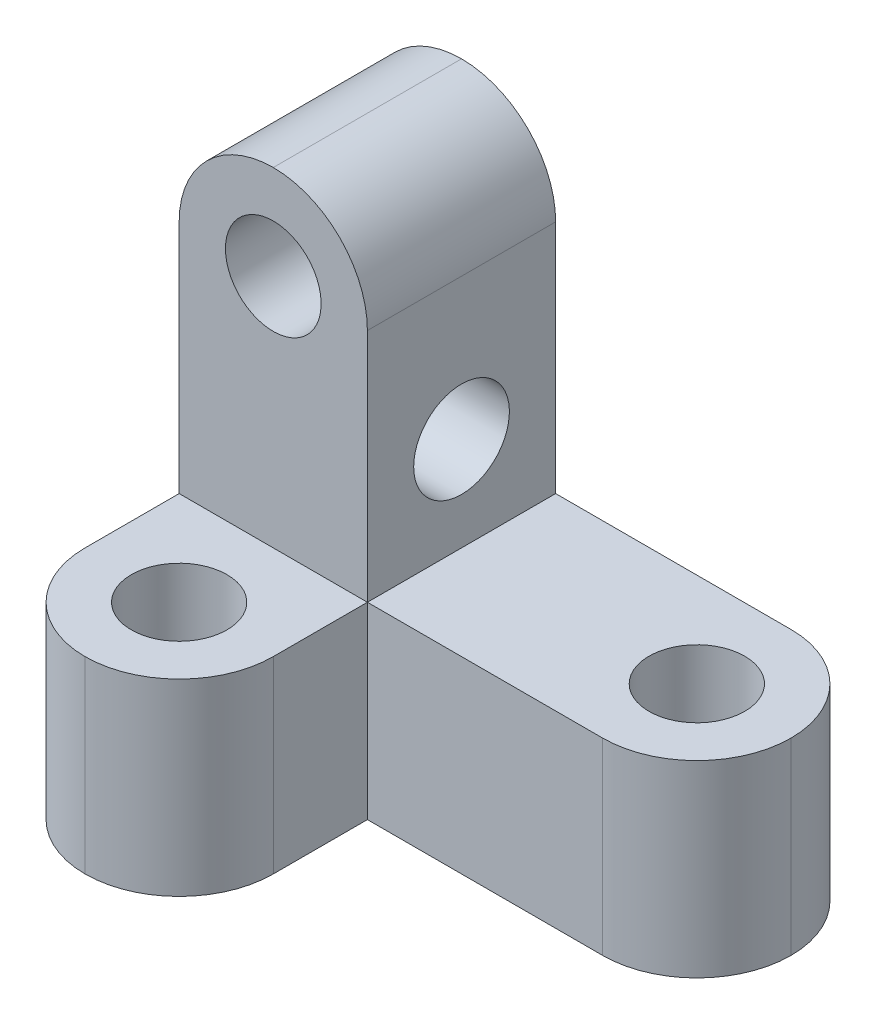
ISO-10303-21;
HEADER;
FILE_DESCRIPTION(('STEP AP214'),'2;1');
FILE_NAME('part.step','',(''),(''),'','','');
FILE_SCHEMA(('AUTOMOTIVE_DESIGN { 1 0 10303 214 1 1 1 1 }'));
ENDSEC;
DATA;
#1=APPLICATION_CONTEXT('core data for automotive mechanical design processes');
#2=APPLICATION_PROTOCOL_DEFINITION('international standard','automotive_design',2000,#1);
#3=PRODUCT_CONTEXT('',#1,'mechanical');
#4=PRODUCT('Part','Part','',(#3));
#5=PRODUCT_RELATED_PRODUCT_CATEGORY('part','',(#4));
#6=PRODUCT_DEFINITION_FORMATION('','',#4);
#7=PRODUCT_DEFINITION_CONTEXT('part definition',#1,'design');
#8=PRODUCT_DEFINITION('design','',#6,#7);
#9=PRODUCT_DEFINITION_SHAPE('','',#8);
#10=(LENGTH_UNIT() NAMED_UNIT(*) SI_UNIT(.MILLI.,.METRE.));
#11=(NAMED_UNIT(*) PLANE_ANGLE_UNIT() SI_UNIT($,.RADIAN.));
#12=(NAMED_UNIT(*) SI_UNIT($,.STERADIAN.) SOLID_ANGLE_UNIT());
#13=UNCERTAINTY_MEASURE_WITH_UNIT(LENGTH_MEASURE(1.E-05),#10,'distance_accuracy_value','');
#14=(GEOMETRIC_REPRESENTATION_CONTEXT(3) GLOBAL_UNCERTAINTY_ASSIGNED_CONTEXT((#13)) GLOBAL_UNIT_ASSIGNED_CONTEXT((#10,
#11,#12)) REPRESENTATION_CONTEXT('',''));
#15=CARTESIAN_POINT('',(0.,0.,0.));
#16=DIRECTION('',(0.,0.,1.));
#17=DIRECTION('',(1.,0.,0.));
#18=AXIS2_PLACEMENT_3D('',#15,#16,#17);
#19=CARTESIAN_POINT('',(12.,33.,0.));
#20=DIRECTION('',(-1.,0.,0.));
#21=DIRECTION('',(0.,-1.,0.));
#22=AXIS2_PLACEMENT_3D('',#19,#20,#21);
#23=PLANE('',#22);
#24=DIRECTION('',(0.,0.,1.));
#25=VECTOR('',#24,1.);
#26=CARTESIAN_POINT('',(12.,12.,0.));
#27=LINE('',#26,#25);
#28=CARTESIAN_POINT('',(12.,12.,12.));
#29=VERTEX_POINT('',#28);
#30=CARTESIAN_POINT('',(12.,12.,18.));
#31=VERTEX_POINT('',#30);
#32=EDGE_CURVE('E138',#29,#31,#27,.T.);
#33=ORIENTED_EDGE('',*,*,#32,.T.);
#34=DIRECTION('',(0.,-1.,0.));
#35=VECTOR('',#34,1.);
#36=CARTESIAN_POINT('',(12.,33.,18.));
#37=LINE('',#36,#35);
#38=CARTESIAN_POINT('',(12.,0.,18.));
#39=VERTEX_POINT('',#38);
#40=EDGE_CURVE('E206',#31,#39,#37,.T.);
#41=ORIENTED_EDGE('',*,*,#40,.T.);
#42=DIRECTION('',(0.,0.,-1.));
#43=VECTOR('',#42,1.);
#44=CARTESIAN_POINT('',(12.,0.,24.));
#45=LINE('',#44,#43);
#46=CARTESIAN_POINT('',(12.,0.,12.));
#47=VERTEX_POINT('',#46);
#48=EDGE_CURVE('E150',#39,#47,#45,.T.);
#49=ORIENTED_EDGE('',*,*,#48,.T.);
#50=DIRECTION('',(0.,-1.,0.));
#51=VECTOR('',#50,1.);
#52=CARTESIAN_POINT('',(12.,33.,12.));
#53=LINE('',#52,#51);
#54=EDGE_CURVE('E154',#29,#47,#53,.T.);
#55=ORIENTED_EDGE('',*,*,#54,.F.);
#56=EDGE_LOOP('',(#33,#41,#49,#55));
#57=FACE_BOUND('',#56,.T.);
#58=ADVANCED_FACE('F32',(#57),#23,.F.);
#59=CARTESIAN_POINT('',(0.,33.,0.));
#60=DIRECTION('',(1.,0.,0.));
#61=DIRECTION('',(0.,0.,-1.));
#62=AXIS2_PLACEMENT_3D('',#59,#60,#61);
#63=PLANE('',#62);
#64=CARTESIAN_POINT('',(0.,18.,6.));
#65=DIRECTION('',(-1.,0.,0.));
#66=DIRECTION('',(0.,0.,1.));
#67=AXIS2_PLACEMENT_3D('',#64,#65,#66);
#68=CIRCLE('',#67,3.05);
#69=CARTESIAN_POINT('',(0.,18.,9.05));
#70=VERTEX_POINT('',#69);
#71=EDGE_CURVE('E179',#70,#70,#68,.T.);
#72=ORIENTED_EDGE('',*,*,#71,.F.);
#73=EDGE_LOOP('',(#72));
#74=FACE_BOUND('',#73,.T.);
#75=DIRECTION('',(0.,0.,1.));
#76=VECTOR('',#75,1.);
#77=CARTESIAN_POINT('',(0.,0.,0.));
#78=LINE('',#77,#76);
#79=CARTESIAN_POINT('',(0.,0.,0.));
#80=VERTEX_POINT('',#79);
#81=CARTESIAN_POINT('',(0.,0.,18.));
#82=VERTEX_POINT('',#81);
#83=EDGE_CURVE('E167',#80,#82,#78,.T.);
#84=ORIENTED_EDGE('',*,*,#83,.T.);
#85=DIRECTION('',(0.,-1.,0.));
#86=VECTOR('',#85,1.);
#87=CARTESIAN_POINT('',(0.,33.,18.));
#88=LINE('',#87,#86);
#89=CARTESIAN_POINT('',(0.,12.,18.));
#90=VERTEX_POINT('',#89);
#91=EDGE_CURVE('E145',#82,#90,#88,.F.);
#92=ORIENTED_EDGE('',*,*,#91,.T.);
#93=DIRECTION('',(0.,0.,1.));
#94=VECTOR('',#93,1.);
#95=CARTESIAN_POINT('',(0.,12.,24.));
#96=LINE('',#95,#94);
#97=CARTESIAN_POINT('',(0.,12.,12.));
#98=VERTEX_POINT('',#97);
#99=EDGE_CURVE('E131',#98,#90,#96,.T.);
#100=ORIENTED_EDGE('',*,*,#99,.F.);
#101=DIRECTION('',(0.,-1.,0.));
#102=VECTOR('',#101,1.);
#103=CARTESIAN_POINT('',(0.,33.,12.));
#104=LINE('',#103,#102);
#105=CARTESIAN_POINT('',(0.,27.,12.));
#106=VERTEX_POINT('',#105);
#107=EDGE_CURVE('E120',#106,#98,#104,.T.);
#108=ORIENTED_EDGE('',*,*,#107,.F.);
#109=DIRECTION('',(0.,0.,1.));
#110=VECTOR('',#109,1.);
#111=CARTESIAN_POINT('',(0.,27.,0.));
#112=LINE('',#111,#110);
#113=CARTESIAN_POINT('',(0.,27.,0.));
#114=VERTEX_POINT('',#113);
#115=EDGE_CURVE('E199',#106,#114,#112,.F.);
#116=ORIENTED_EDGE('',*,*,#115,.T.);
#117=DIRECTION('',(0.,-1.,0.));
#118=VECTOR('',#117,1.);
#119=CARTESIAN_POINT('',(0.,33.,0.));
#120=LINE('',#119,#118);
#121=EDGE_CURVE('E172',#114,#80,#120,.T.);
#122=ORIENTED_EDGE('',*,*,#121,.T.);
#123=EDGE_LOOP('',(#84,#92,#100,#108,#116,#122));
#124=FACE_BOUND('',#123,.T.);
#125=ADVANCED_FACE('F143',(#74,#124),#63,.F.);
#126=CARTESIAN_POINT('',(0.,33.,0.));
#127=DIRECTION('',(0.,0.,1.));
#128=DIRECTION('',(1.,0.,0.));
#129=AXIS2_PLACEMENT_3D('',#126,#127,#128);
#130=PLANE('',#129);
#131=CARTESIAN_POINT('',(6.,27.,0.));
#132=DIRECTION('',(0.,0.,-1.));
#133=DIRECTION('',(-1.,0.,0.));
#134=AXIS2_PLACEMENT_3D('',#131,#132,#133);
#135=CIRCLE('',#134,3.05);
#136=CARTESIAN_POINT('',(2.95,27.,0.));
#137=VERTEX_POINT('',#136);
#138=EDGE_CURVE('E191',#137,#137,#135,.T.);
#139=ORIENTED_EDGE('',*,*,#138,.F.);
#140=EDGE_LOOP('',(#139));
#141=FACE_BOUND('',#140,.T.);
#142=CARTESIAN_POINT('',(6.,27.,0.));
#143=DIRECTION('',(0.,0.,1.));
#144=DIRECTION('',(1.,0.,0.));
#145=AXIS2_PLACEMENT_3D('',#142,#143,#144);
#146=CIRCLE('',#145,6.);
#147=CARTESIAN_POINT('',(6.,33.,0.));
#148=VERTEX_POINT('',#147);
#149=EDGE_CURVE('E217',#114,#148,#146,.F.);
#150=ORIENTED_EDGE('',*,*,#149,.T.);
#151=CARTESIAN_POINT('',(6.,27.,0.));
#152=DIRECTION('',(0.,0.,1.));
#153=DIRECTION('',(1.,0.,0.));
#154=AXIS2_PLACEMENT_3D('',#151,#152,#153);
#155=CIRCLE('',#154,6.);
#156=CARTESIAN_POINT('',(12.,27.,0.));
#157=VERTEX_POINT('',#156);
#158=EDGE_CURVE('E219',#148,#157,#155,.F.);
#159=ORIENTED_EDGE('',*,*,#158,.T.);
#160=DIRECTION('',(0.,-1.,0.));
#161=VECTOR('',#160,1.);
#162=CARTESIAN_POINT('',(12.,33.,0.));
#163=LINE('',#162,#161);
#164=CARTESIAN_POINT('',(12.,12.,0.));
#165=VERTEX_POINT('',#164);
#166=EDGE_CURVE('E159',#157,#165,#163,.T.);
#167=ORIENTED_EDGE('',*,*,#166,.T.);
#168=DIRECTION('',(1.,0.,0.));
#169=VECTOR('',#168,1.);
#170=CARTESIAN_POINT('',(33.,12.,0.));
#171=LINE('',#170,#169);
#172=CARTESIAN_POINT('',(27.,12.,0.));
#173=VERTEX_POINT('',#172);
#174=EDGE_CURVE('E161',#165,#173,#171,.T.);
#175=ORIENTED_EDGE('',*,*,#174,.T.);
#176=DIRECTION('',(0.,-1.,0.));
#177=VECTOR('',#176,1.);
#178=CARTESIAN_POINT('',(27.,33.,0.));
#179=LINE('',#178,#177);
#180=CARTESIAN_POINT('',(27.,0.,0.));
#181=VERTEX_POINT('',#180);
#182=EDGE_CURVE('E214',#173,#181,#179,.T.);
#183=ORIENTED_EDGE('',*,*,#182,.T.);
#184=DIRECTION('',(-1.,0.,0.));
#185=VECTOR('',#184,1.);
#186=CARTESIAN_POINT('',(0.,0.,0.));
#187=LINE('',#186,#185);
#188=EDGE_CURVE('E169',#181,#80,#187,.T.);
#189=ORIENTED_EDGE('',*,*,#188,.T.);
#190=ORIENTED_EDGE('',*,*,#121,.F.);
#191=EDGE_LOOP('',(#150,#159,#167,#175,#183,#189,#190));
#192=FACE_BOUND('',#191,.T.);
#193=ADVANCED_FACE('F257',(#141,#192),#130,.F.);
#194=CARTESIAN_POINT('',(0.,0.,0.));
#195=DIRECTION('',(0.,1.,0.));
#196=DIRECTION('',(0.,0.,1.));
#197=AXIS2_PLACEMENT_3D('',#194,#195,#196);
#198=PLANE('',#197);
#199=CARTESIAN_POINT('',(6.,0.,18.));
#200=DIRECTION('',(0.,-1.,0.));
#201=DIRECTION('',(0.,0.,-1.));
#202=AXIS2_PLACEMENT_3D('',#199,#200,#201);
#203=CIRCLE('',#202,3.05);
#204=CARTESIAN_POINT('',(6.,0.,14.95));
#205=VERTEX_POINT('',#204);
#206=EDGE_CURVE('E184',#205,#205,#203,.T.);
#207=ORIENTED_EDGE('',*,*,#206,.F.);
#208=EDGE_LOOP('',(#207));
#209=FACE_BOUND('',#208,.T.);
#210=CARTESIAN_POINT('',(27.,0.,6.));
#211=DIRECTION('',(0.,-1.,0.));
#212=DIRECTION('',(0.,0.,-1.));
#213=AXIS2_PLACEMENT_3D('',#210,#211,#212);
#214=CIRCLE('',#213,3.05);
#215=CARTESIAN_POINT('',(27.,0.,2.95));
#216=VERTEX_POINT('',#215);
#217=EDGE_CURVE('E190',#216,#216,#214,.T.);
#218=ORIENTED_EDGE('',*,*,#217,.F.);
#219=EDGE_LOOP('',(#218));
#220=FACE_BOUND('',#219,.T.);
#221=CARTESIAN_POINT('',(6.00000000000001,0.,18.));
#222=DIRECTION('',(0.,1.,0.));
#223=DIRECTION('',(0.,0.,1.));
#224=AXIS2_PLACEMENT_3D('',#221,#222,#223);
#225=CIRCLE('',#224,6.);
#226=CARTESIAN_POINT('',(6.00000000000001,0.,24.));
#227=VERTEX_POINT('',#226);
#228=EDGE_CURVE('E195',#39,#227,#225,.F.);
#229=ORIENTED_EDGE('',*,*,#228,.T.);
#230=CARTESIAN_POINT('',(6.,0.,18.));
#231=DIRECTION('',(0.,1.,0.));
#232=DIRECTION('',(0.,0.,1.));
#233=AXIS2_PLACEMENT_3D('',#230,#231,#232);
#234=CIRCLE('',#233,6.);
#235=EDGE_CURVE('E197',#227,#82,#234,.F.);
#236=ORIENTED_EDGE('',*,*,#235,.T.);
#237=ORIENTED_EDGE('',*,*,#83,.F.);
#238=ORIENTED_EDGE('',*,*,#188,.F.);
#239=CARTESIAN_POINT('',(27.,0.,6.));
#240=DIRECTION('',(0.,1.,0.));
#241=DIRECTION('',(0.,0.,1.));
#242=AXIS2_PLACEMENT_3D('',#239,#240,#241);
#243=CIRCLE('',#242,6.);
#244=CARTESIAN_POINT('',(33.,0.,6.));
#245=VERTEX_POINT('',#244);
#246=EDGE_CURVE('E193',#181,#245,#243,.F.);
#247=ORIENTED_EDGE('',*,*,#246,.T.);
#248=CARTESIAN_POINT('',(27.,0.,6.));
#249=DIRECTION('',(0.,1.,0.));
#250=DIRECTION('',(0.,0.,1.));
#251=AXIS2_PLACEMENT_3D('',#248,#249,#250);
#252=CIRCLE('',#251,6.);
#253=CARTESIAN_POINT('',(27.,0.,12.));
#254=VERTEX_POINT('',#253);
#255=EDGE_CURVE('E176',#245,#254,#252,.F.);
#256=ORIENTED_EDGE('',*,*,#255,.T.);
#257=DIRECTION('',(1.,0.,0.));
#258=VECTOR('',#257,1.);
#259=CARTESIAN_POINT('',(33.,0.,12.));
#260=LINE('',#259,#258);
#261=EDGE_CURVE('E152',#47,#254,#260,.T.);
#262=ORIENTED_EDGE('',*,*,#261,.F.);
#263=ORIENTED_EDGE('',*,*,#48,.F.);
#264=EDGE_LOOP('',(#229,#236,#237,#238,#247,#256,#262,#263));
#265=FACE_BOUND('',#264,.T.);
#266=ADVANCED_FACE('F239',(#209,#220,#265),#198,.F.);
#267=CARTESIAN_POINT('',(33.,12.,0.));
#268=DIRECTION('',(0.,-1.,0.));
#269=DIRECTION('',(1.,0.,0.));
#270=AXIS2_PLACEMENT_3D('',#267,#268,#269);
#271=PLANE('',#270);
#272=CARTESIAN_POINT('',(27.,12.,6.));
#273=DIRECTION('',(0.,-1.,0.));
#274=DIRECTION('',(1.,0.,0.));
#275=AXIS2_PLACEMENT_3D('',#272,#273,#274);
#276=CIRCLE('',#275,3.05);
#277=CARTESIAN_POINT('',(30.05,12.,6.));
#278=VERTEX_POINT('',#277);
#279=EDGE_CURVE('E183',#278,#278,#276,.T.);
#280=ORIENTED_EDGE('',*,*,#279,.T.);
#281=EDGE_LOOP('',(#280));
#282=FACE_BOUND('',#281,.T.);
#283=CARTESIAN_POINT('',(27.,12.,6.));
#284=DIRECTION('',(0.,-1.,0.));
#285=DIRECTION('',(1.,0.,0.));
#286=AXIS2_PLACEMENT_3D('',#283,#284,#285);
#287=CIRCLE('',#286,6.);
#288=CARTESIAN_POINT('',(27.,12.,12.));
#289=VERTEX_POINT('',#288);
#290=CARTESIAN_POINT('',(33.,12.,6.));
#291=VERTEX_POINT('',#290);
#292=EDGE_CURVE('E49',#289,#291,#287,.F.);
#293=ORIENTED_EDGE('',*,*,#292,.T.);
#294=CARTESIAN_POINT('',(27.,12.,6.));
#295=DIRECTION('',(0.,-1.,0.));
#296=DIRECTION('',(1.,0.,0.));
#297=AXIS2_PLACEMENT_3D('',#294,#295,#296);
#298=CIRCLE('',#297,6.);
#299=EDGE_CURVE('E41',#291,#173,#298,.F.);
#300=ORIENTED_EDGE('',*,*,#299,.T.);
#301=ORIENTED_EDGE('',*,*,#174,.F.);
#302=DIRECTION('',(0.,0.,1.));
#303=VECTOR('',#302,1.);
#304=CARTESIAN_POINT('',(12.,12.,0.));
#305=LINE('',#304,#303);
#306=EDGE_CURVE('E164',#165,#29,#305,.T.);
#307=ORIENTED_EDGE('',*,*,#306,.T.);
#308=DIRECTION('',(1.,0.,0.));
#309=VECTOR('',#308,1.);
#310=CARTESIAN_POINT('',(33.,12.,12.));
#311=LINE('',#310,#309);
#312=EDGE_CURVE('E157',#29,#289,#311,.T.);
#313=ORIENTED_EDGE('',*,*,#312,.T.);
#314=EDGE_LOOP('',(#293,#300,#301,#307,#313));
#315=FACE_BOUND('',#314,.T.);
#316=ADVANCED_FACE('F261',(#282,#315),#271,.F.);
#317=CARTESIAN_POINT('',(12.,18.,6.));
#318=DIRECTION('',(-1.,0.,0.));
#319=DIRECTION('',(0.,-1.,0.));
#320=AXIS2_PLACEMENT_3D('',#317,#318,#319);
#321=CIRCLE('',#320,3.05);
#322=CARTESIAN_POINT('',(12.,14.95,6.));
#323=VERTEX_POINT('',#322);
#324=EDGE_CURVE('E132',#323,#323,#321,.T.);
#325=ORIENTED_EDGE('',*,*,#324,.T.);
#326=EDGE_LOOP('',(#325));
#327=FACE_BOUND('',#326,.T.);
#328=ORIENTED_EDGE('',*,*,#166,.F.);
#329=DIRECTION('',(0.,0.,1.));
#330=VECTOR('',#329,1.);
#331=CARTESIAN_POINT('',(12.,27.,12.));
#332=LINE('',#331,#330);
#333=CARTESIAN_POINT('',(12.,27.,12.));
#334=VERTEX_POINT('',#333);
#335=EDGE_CURVE('E208',#157,#334,#332,.T.);
#336=ORIENTED_EDGE('',*,*,#335,.T.);
#337=DIRECTION('',(0.,-1.,0.));
#338=VECTOR('',#337,1.);
#339=CARTESIAN_POINT('',(12.,33.,12.));
#340=LINE('',#339,#338);
#341=EDGE_CURVE('E174',#334,#29,#340,.T.);
#342=ORIENTED_EDGE('',*,*,#341,.T.);
#343=ORIENTED_EDGE('',*,*,#306,.F.);
#344=EDGE_LOOP('',(#328,#336,#342,#343));
#345=FACE_BOUND('',#344,.T.);
#346=ADVANCED_FACE('F263',(#327,#345),#23,.F.);
#347=CARTESIAN_POINT('',(33.,33.,12.));
#348=DIRECTION('',(0.,0.,-1.));
#349=DIRECTION('',(-1.,0.,0.));
#350=AXIS2_PLACEMENT_3D('',#347,#348,#349);
#351=PLANE('',#350);
#352=ORIENTED_EDGE('',*,*,#261,.T.);
#353=DIRECTION('',(0.,-1.,0.));
#354=VECTOR('',#353,1.);
#355=CARTESIAN_POINT('',(27.,33.,12.));
#356=LINE('',#355,#354);
#357=EDGE_CURVE('E11',#254,#289,#356,.F.);
#358=ORIENTED_EDGE('',*,*,#357,.T.);
#359=ORIENTED_EDGE('',*,*,#312,.F.);
#360=ORIENTED_EDGE('',*,*,#54,.T.);
#361=EDGE_LOOP('',(#352,#358,#359,#360));
#362=FACE_BOUND('',#361,.T.);
#363=ADVANCED_FACE('F242',(#362),#351,.F.);
#364=CARTESIAN_POINT('',(33.,33.,12.));
#365=DIRECTION('',(0.,0.,-1.));
#366=DIRECTION('',(0.,1.,0.));
#367=AXIS2_PLACEMENT_3D('',#364,#365,#366);
#368=PLANE('',#367);
#369=CARTESIAN_POINT('',(6.,27.,12.));
#370=DIRECTION('',(0.,0.,-1.));
#371=DIRECTION('',(0.,1.,0.));
#372=AXIS2_PLACEMENT_3D('',#369,#370,#371);
#373=CIRCLE('',#372,3.05);
#374=CARTESIAN_POINT('',(2.95,27.,12.));
#375=VERTEX_POINT('',#374);
#376=EDGE_CURVE('E187',#375,#375,#373,.T.);
#377=ORIENTED_EDGE('',*,*,#376,.T.);
#378=EDGE_LOOP('',(#377));
#379=FACE_BOUND('',#378,.T.);
#380=ORIENTED_EDGE('',*,*,#341,.F.);
#381=CARTESIAN_POINT('',(6.,27.,12.));
#382=DIRECTION('',(0.,0.,-1.));
#383=DIRECTION('',(0.,1.,0.));
#384=AXIS2_PLACEMENT_3D('',#381,#382,#383);
#385=CIRCLE('',#384,6.);
#386=CARTESIAN_POINT('',(6.,33.,12.));
#387=VERTEX_POINT('',#386);
#388=EDGE_CURVE('E212',#334,#387,#385,.F.);
#389=ORIENTED_EDGE('',*,*,#388,.T.);
#390=CARTESIAN_POINT('',(6.,27.,12.));
#391=DIRECTION('',(0.,0.,-1.));
#392=DIRECTION('',(0.,1.,0.));
#393=AXIS2_PLACEMENT_3D('',#390,#391,#392);
#394=CIRCLE('',#393,6.);
#395=EDGE_CURVE('E127',#387,#106,#394,.F.);
#396=ORIENTED_EDGE('',*,*,#395,.T.);
#397=ORIENTED_EDGE('',*,*,#107,.T.);
#398=DIRECTION('',(-1.,0.,0.));
#399=VECTOR('',#398,1.);
#400=CARTESIAN_POINT('',(33.,12.,12.));
#401=LINE('',#400,#399);
#402=EDGE_CURVE('E124',#29,#98,#401,.T.);
#403=ORIENTED_EDGE('',*,*,#402,.F.);
#404=EDGE_LOOP('',(#380,#389,#396,#397,#403));
#405=FACE_BOUND('',#404,.T.);
#406=ADVANCED_FACE('F123',(#379,#405),#368,.F.);
#407=CARTESIAN_POINT('',(33.,12.,24.));
#408=DIRECTION('',(0.,-1.,0.));
#409=DIRECTION('',(0.,0.,-1.));
#410=AXIS2_PLACEMENT_3D('',#407,#408,#409);
#411=PLANE('',#410);
#412=CARTESIAN_POINT('',(6.,12.,18.));
#413=DIRECTION('',(0.,-1.,0.));
#414=DIRECTION('',(0.,0.,-1.));
#415=AXIS2_PLACEMENT_3D('',#412,#413,#414);
#416=CIRCLE('',#415,3.05);
#417=CARTESIAN_POINT('',(6.,12.,14.95));
#418=VERTEX_POINT('',#417);
#419=EDGE_CURVE('E180',#418,#418,#416,.T.);
#420=ORIENTED_EDGE('',*,*,#419,.T.);
#421=EDGE_LOOP('',(#420));
#422=FACE_BOUND('',#421,.T.);
#423=ORIENTED_EDGE('',*,*,#99,.T.);
#424=CARTESIAN_POINT('',(6.,12.,18.));
#425=DIRECTION('',(0.,-1.,0.));
#426=DIRECTION('',(0.,0.,-1.));
#427=AXIS2_PLACEMENT_3D('',#424,#425,#426);
#428=CIRCLE('',#427,6.);
#429=CARTESIAN_POINT('',(6.00000000000001,12.,24.));
#430=VERTEX_POINT('',#429);
#431=EDGE_CURVE('E204',#90,#430,#428,.F.);
#432=ORIENTED_EDGE('',*,*,#431,.T.);
#433=CARTESIAN_POINT('',(6.00000000000001,12.,18.));
#434=DIRECTION('',(0.,-1.,0.));
#435=DIRECTION('',(0.,0.,-1.));
#436=AXIS2_PLACEMENT_3D('',#433,#434,#435);
#437=CIRCLE('',#436,6.);
#438=EDGE_CURVE('E202',#430,#31,#437,.F.);
#439=ORIENTED_EDGE('',*,*,#438,.T.);
#440=ORIENTED_EDGE('',*,*,#32,.F.);
#441=ORIENTED_EDGE('',*,*,#402,.T.);
#442=EDGE_LOOP('',(#423,#432,#439,#440,#441));
#443=FACE_BOUND('',#442,.T.);
#444=ADVANCED_FACE('F136',(#422,#443),#411,.F.);
#445=CARTESIAN_POINT('',(33.,18.,6.));
#446=DIRECTION('',(-1.,0.,0.));
#447=DIRECTION('',(0.,0.,1.));
#448=AXIS2_PLACEMENT_3D('',#445,#446,#447);
#449=CYLINDRICAL_SURFACE('',#448,3.05);
#450=ORIENTED_EDGE('',*,*,#71,.T.);
#451=EDGE_LOOP('',(#450));
#452=FACE_BOUND('',#451,.T.);
#453=ORIENTED_EDGE('',*,*,#324,.F.);
#454=EDGE_LOOP('',(#453));
#455=FACE_BOUND('',#454,.T.);
#456=ADVANCED_FACE('F295',(#452,#455),#449,.F.);
#457=CARTESIAN_POINT('',(6.,33.,18.));
#458=DIRECTION('',(0.,-1.,0.));
#459=DIRECTION('',(0.,0.,-1.));
#460=AXIS2_PLACEMENT_3D('',#457,#458,#459);
#461=CYLINDRICAL_SURFACE('',#460,3.05);
#462=ORIENTED_EDGE('',*,*,#206,.T.);
#463=EDGE_LOOP('',(#462));
#464=FACE_BOUND('',#463,.T.);
#465=ORIENTED_EDGE('',*,*,#419,.F.);
#466=EDGE_LOOP('',(#465));
#467=FACE_BOUND('',#466,.T.);
#468=ADVANCED_FACE('F297',(#464,#467),#461,.F.);
#469=CARTESIAN_POINT('',(27.,33.,6.));
#470=DIRECTION('',(0.,-1.,0.));
#471=DIRECTION('',(0.,0.,-1.));
#472=AXIS2_PLACEMENT_3D('',#469,#470,#471);
#473=CYLINDRICAL_SURFACE('',#472,3.05);
#474=ORIENTED_EDGE('',*,*,#217,.T.);
#475=EDGE_LOOP('',(#474));
#476=FACE_BOUND('',#475,.T.);
#477=ORIENTED_EDGE('',*,*,#279,.F.);
#478=EDGE_LOOP('',(#477));
#479=FACE_BOUND('',#478,.T.);
#480=ADVANCED_FACE('F304',(#476,#479),#473,.F.);
#481=CARTESIAN_POINT('',(6.,27.,24.));
#482=DIRECTION('',(0.,0.,-1.));
#483=DIRECTION('',(-1.,0.,0.));
#484=AXIS2_PLACEMENT_3D('',#481,#482,#483);
#485=CYLINDRICAL_SURFACE('',#484,3.05);
#486=CARTESIAN_POINT('',(2.95,27.,0.));
#487=CARTESIAN_POINT('',(2.95,27.,0.125));
#488=CARTESIAN_POINT('',(2.95,27.,0.25));
#489=CARTESIAN_POINT('',(2.95,27.,0.5));
#490=CARTESIAN_POINT('',(2.95,27.,0.625000000000001));
#491=CARTESIAN_POINT('',(2.95,27.,0.875000000000001));
#492=CARTESIAN_POINT('',(2.95,27.,1.));
#493=CARTESIAN_POINT('',(2.95,27.,1.25));
#494=CARTESIAN_POINT('',(2.95,27.,1.375));
#495=CARTESIAN_POINT('',(2.95,27.,1.625));
#496=CARTESIAN_POINT('',(2.95,27.,1.75));
#497=CARTESIAN_POINT('',(2.95,27.,2.));
#498=CARTESIAN_POINT('',(2.95,27.,2.125));
#499=CARTESIAN_POINT('',(2.95,27.,2.375));
#500=CARTESIAN_POINT('',(2.95,27.,2.5));
#501=CARTESIAN_POINT('',(2.95,27.,2.75));
#502=CARTESIAN_POINT('',(2.95,27.,2.875));
#503=CARTESIAN_POINT('',(2.95,27.,3.125));
#504=CARTESIAN_POINT('',(2.95,27.,3.25));
#505=CARTESIAN_POINT('',(2.95,27.,3.5));
#506=CARTESIAN_POINT('',(2.95,27.,3.625));
#507=CARTESIAN_POINT('',(2.95,27.,3.875));
#508=CARTESIAN_POINT('',(2.95,27.,4.));
#509=CARTESIAN_POINT('',(2.95,27.,4.25));
#510=CARTESIAN_POINT('',(2.95,27.,4.375));
#511=CARTESIAN_POINT('',(2.95,27.,4.625));
#512=CARTESIAN_POINT('',(2.95,27.,4.75));
#513=CARTESIAN_POINT('',(2.95,27.,5.));
#514=CARTESIAN_POINT('',(2.95,27.,5.125));
#515=CARTESIAN_POINT('',(2.95,27.,5.375));
#516=CARTESIAN_POINT('',(2.95,27.,5.5));
#517=CARTESIAN_POINT('',(2.95,27.,5.75));
#518=CARTESIAN_POINT('',(2.95,27.,5.875));
#519=CARTESIAN_POINT('',(2.95,27.,6.125));
#520=CARTESIAN_POINT('',(2.95,27.,6.25));
#521=CARTESIAN_POINT('',(2.95,27.,6.5));
#522=CARTESIAN_POINT('',(2.95,27.,6.625));
#523=CARTESIAN_POINT('',(2.95,27.,6.875));
#524=CARTESIAN_POINT('',(2.95,27.,7.));
#525=CARTESIAN_POINT('',(2.95,27.,7.25));
#526=CARTESIAN_POINT('',(2.95,27.,7.375));
#527=CARTESIAN_POINT('',(2.95,27.,7.625));
#528=CARTESIAN_POINT('',(2.95,27.,7.75));
#529=CARTESIAN_POINT('',(2.95,27.,8.));
#530=CARTESIAN_POINT('',(2.95,27.,8.125));
#531=CARTESIAN_POINT('',(2.95,27.,8.375));
#532=CARTESIAN_POINT('',(2.95,27.,8.5));
#533=CARTESIAN_POINT('',(2.95,27.,8.75));
#534=CARTESIAN_POINT('',(2.95,27.,8.875));
#535=CARTESIAN_POINT('',(2.95,27.,9.125));
#536=CARTESIAN_POINT('',(2.95,27.,9.25));
#537=CARTESIAN_POINT('',(2.95,27.,9.5));
#538=CARTESIAN_POINT('',(2.95,27.,9.625));
#539=CARTESIAN_POINT('',(2.95,27.,9.875));
#540=CARTESIAN_POINT('',(2.95,27.,10.));
#541=CARTESIAN_POINT('',(2.95,27.,10.25));
#542=CARTESIAN_POINT('',(2.95,27.,10.375));
#543=CARTESIAN_POINT('',(2.95,27.,10.625));
#544=CARTESIAN_POINT('',(2.95,27.,10.75));
#545=CARTESIAN_POINT('',(2.95,27.,11.));
#546=CARTESIAN_POINT('',(2.95,27.,11.125));
#547=CARTESIAN_POINT('',(2.95,27.,11.375));
#548=CARTESIAN_POINT('',(2.95,27.,11.5));
#549=CARTESIAN_POINT('',(2.95,27.,11.75));
#550=CARTESIAN_POINT('',(2.95,27.,11.875));
#551=CARTESIAN_POINT('',(2.95,27.,12.));
#552=B_SPLINE_CURVE_WITH_KNOTS('',3,(#486,#487,#488,#489,#490,#491,#492,#493,#494,#495,#496,
#497,#498,#499,#500,#501,#502,#503,#504,#505,#506,#507,#508,#509,#510,#511,#512,#513,#514,#515,
#516,#517,#518,#519,#520,#521,#522,#523,#524,#525,#526,#527,#528,#529,#530,#531,#532,#533,#534,
#535,#536,#537,#538,#539,#540,#541,#542,#543,#544,#545,#546,#547,#548,#549,#550,#551),
.UNSPECIFIED.,.F.,.F.,(4,2,2,2,2,2,2,2,2,2,2,2,2,2,2,2,2,2,2,2,2,2,2,2,2,2,2,2,2,2,2,2,4),(0.,
0.375,0.750000000000001,1.125,1.5,1.875,2.25,2.625,3.,3.375,3.75,4.125,4.5,4.875,5.25,5.625,6.,
6.375,6.75,7.125,7.5,7.875,8.25,8.625,9.,9.375,9.75,10.125,10.5,10.875,11.25,11.625,12.),.UNSPECIFIED.);
#553=EDGE_CURVE('BSEAM318',#137,#375,#552,.T.);
#554=ORIENTED_EDGE('',*,*,#138,.T.);
#555=ORIENTED_EDGE('',*,*,#376,.F.);
#556=ORIENTED_EDGE('',*,*,#553,.T.);
#557=ORIENTED_EDGE('',*,*,#553,.F.);
#558=EDGE_LOOP('',(#554,#556,#555,#557));
#559=FACE_BOUND('',#558,.T.);
#560=ADVANCED_FACE('F318',(#559),#485,.F.);
#561=CARTESIAN_POINT('',(6.,33.,18.));
#562=DIRECTION('',(0.,-1.,0.));
#563=DIRECTION('',(1.,0.,0.));
#564=AXIS2_PLACEMENT_3D('',#561,#562,#563);
#565=CYLINDRICAL_SURFACE('',#564,6.);
#566=ORIENTED_EDGE('',*,*,#40,.F.);
#567=ORIENTED_EDGE('',*,*,#438,.F.);
#568=DIRECTION('',(0.,-1.,0.));
#569=VECTOR('',#568,1.);
#570=CARTESIAN_POINT('',(6.,33.,24.));
#571=LINE('',#570,#569);
#572=EDGE_CURVE('E223',#227,#430,#571,.F.);
#573=ORIENTED_EDGE('',*,*,#572,.F.);
#574=ORIENTED_EDGE('',*,*,#228,.F.);
#575=EDGE_LOOP('',(#566,#567,#573,#574));
#576=FACE_BOUND('',#575,.T.);
#577=ADVANCED_FACE('F248',(#576),#565,.T.);
#578=CARTESIAN_POINT('',(6.,33.,18.));
#579=DIRECTION('',(0.,-1.,0.));
#580=DIRECTION('',(0.,0.,-1.));
#581=AXIS2_PLACEMENT_3D('',#578,#579,#580);
#582=CYLINDRICAL_SURFACE('',#581,6.);
#583=ORIENTED_EDGE('',*,*,#431,.F.);
#584=ORIENTED_EDGE('',*,*,#91,.F.);
#585=ORIENTED_EDGE('',*,*,#235,.F.);
#586=ORIENTED_EDGE('',*,*,#572,.T.);
#587=EDGE_LOOP('',(#583,#584,#585,#586));
#588=FACE_BOUND('',#587,.T.);
#589=ADVANCED_FACE('F252',(#588),#582,.T.);
#590=CARTESIAN_POINT('',(6.,27.,0.));
#591=DIRECTION('',(0.,0.,-1.));
#592=DIRECTION('',(-1.,0.,0.));
#593=AXIS2_PLACEMENT_3D('',#590,#591,#592);
#594=CYLINDRICAL_SURFACE('',#593,6.);
#595=DIRECTION('',(0.,0.,1.));
#596=VECTOR('',#595,1.);
#597=CARTESIAN_POINT('',(6.,33.,12.));
#598=LINE('',#597,#596);
#599=EDGE_CURVE('E225',#148,#387,#598,.T.);
#600=ORIENTED_EDGE('',*,*,#599,.F.);
#601=ORIENTED_EDGE('',*,*,#149,.F.);
#602=ORIENTED_EDGE('',*,*,#115,.F.);
#603=ORIENTED_EDGE('',*,*,#395,.F.);
#604=EDGE_LOOP('',(#600,#601,#602,#603));
#605=FACE_BOUND('',#604,.T.);
#606=ADVANCED_FACE('F266',(#605),#594,.T.);
#607=CARTESIAN_POINT('',(6.,27.,0.));
#608=DIRECTION('',(0.,0.,-1.));
#609=DIRECTION('',(-1.,0.,0.));
#610=AXIS2_PLACEMENT_3D('',#607,#608,#609);
#611=CYLINDRICAL_SURFACE('',#610,6.);
#612=ORIENTED_EDGE('',*,*,#158,.F.);
#613=ORIENTED_EDGE('',*,*,#599,.T.);
#614=ORIENTED_EDGE('',*,*,#388,.F.);
#615=ORIENTED_EDGE('',*,*,#335,.F.);
#616=EDGE_LOOP('',(#612,#613,#614,#615));
#617=FACE_BOUND('',#616,.T.);
#618=ADVANCED_FACE('F267',(#617),#611,.T.);
#619=CARTESIAN_POINT('',(27.,33.,6.));
#620=DIRECTION('',(0.,-1.,0.));
#621=DIRECTION('',(0.,0.,-1.));
#622=AXIS2_PLACEMENT_3D('',#619,#620,#621);
#623=CYLINDRICAL_SURFACE('',#622,6.);
#624=DIRECTION('',(0.,-1.,0.));
#625=VECTOR('',#624,1.);
#626=CARTESIAN_POINT('',(33.,33.,6.));
#627=LINE('',#626,#625);
#628=EDGE_CURVE('E36',#291,#245,#627,.T.);
#629=ORIENTED_EDGE('',*,*,#628,.F.);
#630=ORIENTED_EDGE('',*,*,#292,.F.);
#631=ORIENTED_EDGE('',*,*,#357,.F.);
#632=ORIENTED_EDGE('',*,*,#255,.F.);
#633=EDGE_LOOP('',(#629,#630,#631,#632));
#634=FACE_BOUND('',#633,.T.);
#635=ADVANCED_FACE('F34',(#634),#623,.T.);
#636=CARTESIAN_POINT('',(27.,33.,6.));
#637=DIRECTION('',(0.,-1.,0.));
#638=DIRECTION('',(0.,0.,-1.));
#639=AXIS2_PLACEMENT_3D('',#636,#637,#638);
#640=CYLINDRICAL_SURFACE('',#639,6.);
#641=ORIENTED_EDGE('',*,*,#299,.F.);
#642=ORIENTED_EDGE('',*,*,#628,.T.);
#643=ORIENTED_EDGE('',*,*,#246,.F.);
#644=ORIENTED_EDGE('',*,*,#182,.F.);
#645=EDGE_LOOP('',(#641,#642,#643,#644));
#646=FACE_BOUND('',#645,.T.);
#647=ADVANCED_FACE('F233',(#646),#640,.T.);
#648=CLOSED_SHELL('',(#58,#125,#193,#266,#316,#346,#363,#406,#444,#456,#468,#480,#560,#577,#589,
#606,#618,#635,#647));
#649=MANIFOLD_SOLID_BREP('B2',#648);
#650=ADVANCED_BREP_SHAPE_REPRESENTATION('',(#18,#649),#14);
#651=SHAPE_DEFINITION_REPRESENTATION(#9,#650);
ENDSEC;
END-ISO-10303-21;
